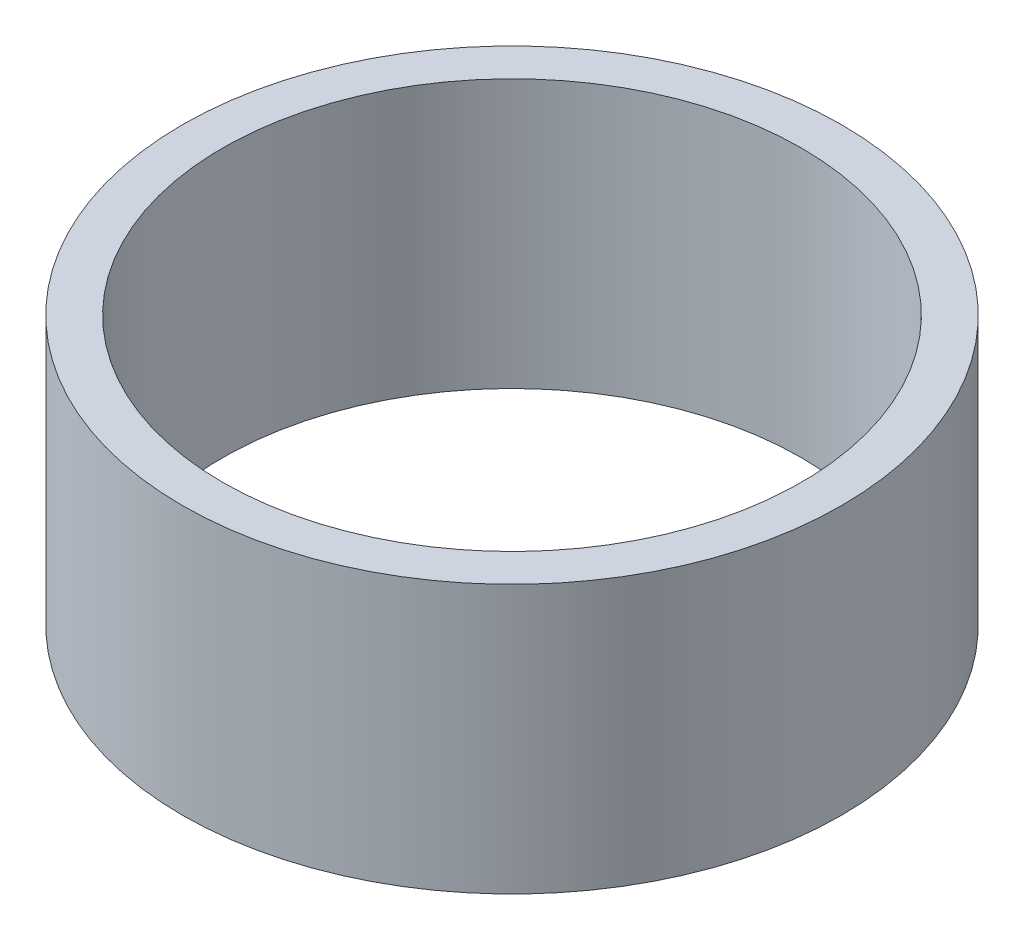
ISO-10303-21;
HEADER;
FILE_DESCRIPTION(('STEP AP214'),'2;1');
FILE_NAME('part.step','',(''),(''),'','','');
FILE_SCHEMA(('AUTOMOTIVE_DESIGN { 1 0 10303 214 1 1 1 1 }'));
ENDSEC;
DATA;
#1=APPLICATION_CONTEXT('core data for automotive mechanical design processes');
#2=APPLICATION_PROTOCOL_DEFINITION('international standard','automotive_design',2000,#1);
#3=PRODUCT_CONTEXT('',#1,'mechanical');
#4=PRODUCT('Part','Part','',(#3));
#5=PRODUCT_RELATED_PRODUCT_CATEGORY('part','',(#4));
#6=PRODUCT_DEFINITION_FORMATION('','',#4);
#7=PRODUCT_DEFINITION_CONTEXT('part definition',#1,'design');
#8=PRODUCT_DEFINITION('design','',#6,#7);
#9=PRODUCT_DEFINITION_SHAPE('','',#8);
#10=(LENGTH_UNIT() NAMED_UNIT(*) SI_UNIT(.MILLI.,.METRE.));
#11=(NAMED_UNIT(*) PLANE_ANGLE_UNIT() SI_UNIT($,.RADIAN.));
#12=(NAMED_UNIT(*) SI_UNIT($,.STERADIAN.) SOLID_ANGLE_UNIT());
#13=UNCERTAINTY_MEASURE_WITH_UNIT(LENGTH_MEASURE(1.E-05),#10,'distance_accuracy_value','');
#14=(GEOMETRIC_REPRESENTATION_CONTEXT(3) GLOBAL_UNCERTAINTY_ASSIGNED_CONTEXT((#13)) GLOBAL_UNIT_ASSIGNED_CONTEXT((#10,
#11,#12)) REPRESENTATION_CONTEXT('',''));
#15=CARTESIAN_POINT('',(0.,0.,0.));
#16=DIRECTION('',(0.,0.,1.));
#17=DIRECTION('',(1.,0.,0.));
#18=AXIS2_PLACEMENT_3D('',#15,#16,#17);
#19=CARTESIAN_POINT('',(0.,10.,0.));
#20=DIRECTION('',(0.,1.,0.));
#21=DIRECTION('',(0.,0.,1.));
#22=AXIS2_PLACEMENT_3D('',#19,#20,#21);
#23=PLANE('',#22);
#24=CARTESIAN_POINT('',(0.,10.,0.));
#25=DIRECTION('',(0.,1.,0.));
#26=DIRECTION('',(0.,0.,1.));
#27=AXIS2_PLACEMENT_3D('',#24,#25,#26);
#28=CIRCLE('',#27,24.5847763108502);
#29=CARTESIAN_POINT('',(0.,10.,24.5847763108502));
#30=VERTEX_POINT('',#29);
#31=EDGE_CURVE('E10',#30,#30,#28,.T.);
#32=ORIENTED_EDGE('',*,*,#31,.T.);
#33=EDGE_LOOP('',(#32));
#34=FACE_BOUND('',#33,.T.);
#35=CARTESIAN_POINT('',(0.,10.,0.));
#36=DIRECTION('',(0.,1.,0.));
#37=DIRECTION('',(0.,0.,1.));
#38=AXIS2_PLACEMENT_3D('',#35,#36,#37);
#39=CIRCLE('',#38,21.5847763108502);
#40=CARTESIAN_POINT('',(0.,10.,21.5847763108502));
#41=VERTEX_POINT('',#40);
#42=EDGE_CURVE('E46',#41,#41,#39,.T.);
#43=ORIENTED_EDGE('',*,*,#42,.F.);
#44=EDGE_LOOP('',(#43));
#45=FACE_BOUND('',#44,.T.);
#46=ADVANCED_FACE('F35',(#34,#45),#23,.T.);
#47=CARTESIAN_POINT('',(0.,-10.,0.));
#48=DIRECTION('',(0.,1.,0.));
#49=DIRECTION('',(0.,0.,1.));
#50=AXIS2_PLACEMENT_3D('',#47,#48,#49);
#51=PLANE('',#50);
#52=CARTESIAN_POINT('',(0.,-10.,0.));
#53=DIRECTION('',(0.,1.,0.));
#54=DIRECTION('',(0.,0.,1.));
#55=AXIS2_PLACEMENT_3D('',#52,#53,#54);
#56=CIRCLE('',#55,24.5847763108502);
#57=CARTESIAN_POINT('',(0.,-10.,24.5847763108502));
#58=VERTEX_POINT('',#57);
#59=EDGE_CURVE('E39',#58,#58,#56,.T.);
#60=ORIENTED_EDGE('',*,*,#59,.F.);
#61=EDGE_LOOP('',(#60));
#62=FACE_BOUND('',#61,.T.);
#63=CARTESIAN_POINT('',(0.,-10.,0.));
#64=DIRECTION('',(0.,1.,0.));
#65=DIRECTION('',(0.,0.,1.));
#66=AXIS2_PLACEMENT_3D('',#63,#64,#65);
#67=CIRCLE('',#66,21.5847763108502);
#68=CARTESIAN_POINT('',(0.,-10.,21.5847763108502));
#69=VERTEX_POINT('',#68);
#70=EDGE_CURVE('E48',#69,#69,#67,.T.);
#71=ORIENTED_EDGE('',*,*,#70,.T.);
#72=EDGE_LOOP('',(#71));
#73=FACE_BOUND('',#72,.T.);
#74=ADVANCED_FACE('F58',(#62,#73),#51,.F.);
#75=CARTESIAN_POINT('',(0.,10.,0.));
#76=DIRECTION('',(0.,-1.,0.));
#77=DIRECTION('',(0.,0.,-1.));
#78=AXIS2_PLACEMENT_3D('',#75,#76,#77);
#79=CYLINDRICAL_SURFACE('',#78,24.5847763108502);
#80=ORIENTED_EDGE('',*,*,#31,.F.);
#81=EDGE_LOOP('',(#80));
#82=FACE_BOUND('',#81,.T.);
#83=ORIENTED_EDGE('',*,*,#59,.T.);
#84=EDGE_LOOP('',(#83));
#85=FACE_BOUND('',#84,.T.);
#86=ADVANCED_FACE('F37',(#82,#85),#79,.T.);
#87=CARTESIAN_POINT('',(0.,10.,0.));
#88=DIRECTION('',(0.,-1.,0.));
#89=DIRECTION('',(0.,0.,-1.));
#90=AXIS2_PLACEMENT_3D('',#87,#88,#89);
#91=CYLINDRICAL_SURFACE('',#90,21.5847763108502);
#92=ORIENTED_EDGE('',*,*,#42,.T.);
#93=EDGE_LOOP('',(#92));
#94=FACE_BOUND('',#93,.T.);
#95=ORIENTED_EDGE('',*,*,#70,.F.);
#96=EDGE_LOOP('',(#95));
#97=FACE_BOUND('',#96,.T.);
#98=ADVANCED_FACE('F54',(#94,#97),#91,.F.);
#99=CLOSED_SHELL('',(#46,#74,#86,#98));
#100=MANIFOLD_SOLID_BREP('B2',#99);
#101=ADVANCED_BREP_SHAPE_REPRESENTATION('',(#18,#100),#14);
#102=SHAPE_DEFINITION_REPRESENTATION(#9,#101);
ENDSEC;
END-ISO-10303-21;
